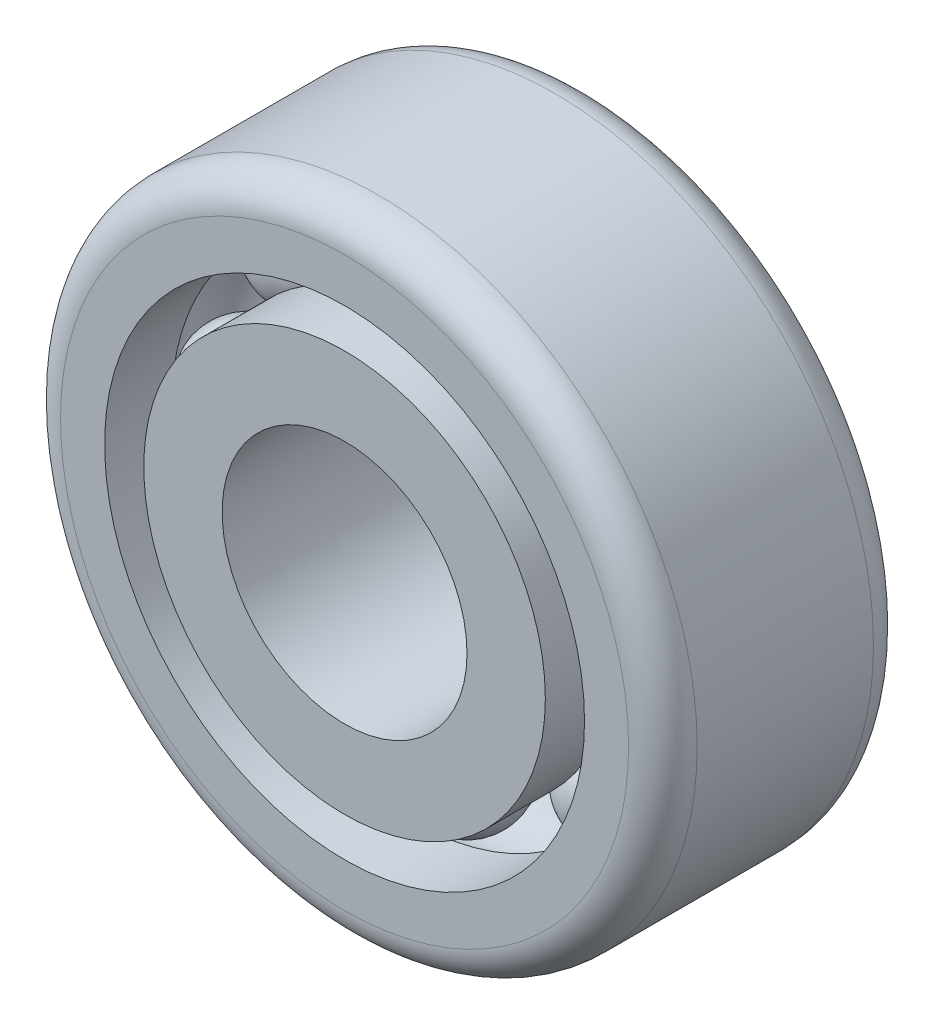
ISO-10303-21;
HEADER;
FILE_DESCRIPTION(('STEP AP214'),'2;1');
FILE_NAME('part.step','',(''),(''),'','','');
FILE_SCHEMA(('AUTOMOTIVE_DESIGN { 1 0 10303 214 1 1 1 1 }'));
ENDSEC;
DATA;
#1=APPLICATION_CONTEXT('core data for automotive mechanical design processes');
#2=APPLICATION_PROTOCOL_DEFINITION('international standard','automotive_design',2000,#1);
#3=PRODUCT_CONTEXT('',#1,'mechanical');
#4=PRODUCT('Part','Part','',(#3));
#5=PRODUCT_RELATED_PRODUCT_CATEGORY('part','',(#4));
#6=PRODUCT_DEFINITION_FORMATION('','',#4);
#7=PRODUCT_DEFINITION_CONTEXT('part definition',#1,'design');
#8=PRODUCT_DEFINITION('design','',#6,#7);
#9=PRODUCT_DEFINITION_SHAPE('','',#8);
#10=(LENGTH_UNIT() NAMED_UNIT(*) SI_UNIT(.MILLI.,.METRE.));
#11=(NAMED_UNIT(*) PLANE_ANGLE_UNIT() SI_UNIT($,.RADIAN.));
#12=(NAMED_UNIT(*) SI_UNIT($,.STERADIAN.) SOLID_ANGLE_UNIT());
#13=UNCERTAINTY_MEASURE_WITH_UNIT(LENGTH_MEASURE(1.E-05),#10,'distance_accuracy_value','');
#14=(GEOMETRIC_REPRESENTATION_CONTEXT(3) GLOBAL_UNCERTAINTY_ASSIGNED_CONTEXT((#13)) GLOBAL_UNIT_ASSIGNED_CONTEXT((#10,
#11,#12)) REPRESENTATION_CONTEXT('',''));
#15=CARTESIAN_POINT('',(0.,0.,0.));
#16=DIRECTION('',(0.,0.,1.));
#17=DIRECTION('',(1.,0.,0.));
#18=AXIS2_PLACEMENT_3D('',#15,#16,#17);
#19=CARTESIAN_POINT('',(-3.1819805153395,-3.18198051533943,0.00277476067090743));
#20=DIRECTION('',(0.,0.,-1.));
#21=DIRECTION('',(0.707106781186556,0.707106781186539,0.));
#22=AXIS2_PLACEMENT_3D('',#19,#20,#21);
#23=SPHERICAL_SURFACE('',#22,1.06393961341105);
#24=CARTESIAN_POINT('',(-3.1819805153395,-3.18198051533943,-1.06116485274014));
#25=VERTEX_POINT('',#24);
#26=VERTEX_LOOP('',#25);
#27=FACE_BOUND('',#26,.T.);
#28=ADVANCED_FACE('F39',(#27),#23,.T.);
#29=CLOSED_SHELL('',(#28));
#30=MANIFOLD_SOLID_BREP('B2',#29);
#31=CARTESIAN_POINT('',(0.,-4.5,0.00277476067090743));
#32=DIRECTION('',(0.,0.,-1.));
#33=DIRECTION('',(0.,1.,0.));
#34=AXIS2_PLACEMENT_3D('',#31,#32,#33);
#35=SPHERICAL_SURFACE('',#34,1.06393961341105);
#36=CARTESIAN_POINT('',(0.,-4.5,-1.06116485274014));
#37=VERTEX_POINT('',#36);
#38=VERTEX_LOOP('',#37);
#39=FACE_BOUND('',#38,.T.);
#40=ADVANCED_FACE('F57',(#39),#35,.T.);
#41=CLOSED_SHELL('',(#40));
#42=MANIFOLD_SOLID_BREP('B6',#41);
#43=CARTESIAN_POINT('',(3.18198051533944,-3.18198051533949,0.00277476067090743));
#44=DIRECTION('',(0.,0.,-1.));
#45=DIRECTION('',(-0.707106781186541,0.707106781186554,0.));
#46=AXIS2_PLACEMENT_3D('',#43,#44,#45);
#47=SPHERICAL_SURFACE('',#46,1.06393961341105);
#48=CARTESIAN_POINT('',(3.18198051533944,-3.18198051533949,-1.06116485274014));
#49=VERTEX_POINT('',#48);
#50=VERTEX_LOOP('',#49);
#51=FACE_BOUND('',#50,.T.);
#52=ADVANCED_FACE('F75',(#51),#47,.T.);
#53=CLOSED_SHELL('',(#52));
#54=MANIFOLD_SOLID_BREP('B35',#53);
#55=CARTESIAN_POINT('',(4.5,0.,0.00277476067090743));
#56=DIRECTION('',(0.,0.,-1.));
#57=DIRECTION('',(-1.,0.,0.));
#58=AXIS2_PLACEMENT_3D('',#55,#56,#57);
#59=SPHERICAL_SURFACE('',#58,1.06393961341105);
#60=CARTESIAN_POINT('',(4.5,0.,-1.06116485274014));
#61=VERTEX_POINT('',#60);
#62=VERTEX_LOOP('',#61);
#63=FACE_BOUND('',#62,.T.);
#64=ADVANCED_FACE('F93',(#63),#59,.T.);
#65=CLOSED_SHELL('',(#64));
#66=MANIFOLD_SOLID_BREP('B53',#65);
#67=CARTESIAN_POINT('',(3.18198051533948,3.18198051533945,0.00277476067090743));
#68=DIRECTION('',(0.,0.,-1.));
#69=DIRECTION('',(-0.707106781186551,-0.707106781186544,0.));
#70=AXIS2_PLACEMENT_3D('',#67,#68,#69);
#71=SPHERICAL_SURFACE('',#70,1.06393961341105);
#72=CARTESIAN_POINT('',(3.18198051533948,3.18198051533945,-1.06116485274014));
#73=VERTEX_POINT('',#72);
#74=VERTEX_LOOP('',#73);
#75=FACE_BOUND('',#74,.T.);
#76=ADVANCED_FACE('F111',(#75),#71,.T.);
#77=CLOSED_SHELL('',(#76));
#78=MANIFOLD_SOLID_BREP('B71',#77);
#79=CARTESIAN_POINT('',(0.,4.5,0.00277476067090743));
#80=DIRECTION('',(0.,0.,-1.));
#81=DIRECTION('',(0.,-1.,0.));
#82=AXIS2_PLACEMENT_3D('',#79,#80,#81);
#83=SPHERICAL_SURFACE('',#82,1.06393961341105);
#84=CARTESIAN_POINT('',(0.,4.5,-1.06116485274014));
#85=VERTEX_POINT('',#84);
#86=VERTEX_LOOP('',#85);
#87=FACE_BOUND('',#86,.T.);
#88=ADVANCED_FACE('F129',(#87),#83,.T.);
#89=CLOSED_SHELL('',(#88));
#90=MANIFOLD_SOLID_BREP('B89',#89);
#91=CARTESIAN_POINT('',(-3.18198051533946,3.18198051533947,0.00277476067090743));
#92=DIRECTION('',(0.,0.,-1.));
#93=DIRECTION('',(0.707106781186546,-0.707106781186549,0.));
#94=AXIS2_PLACEMENT_3D('',#91,#92,#93);
#95=SPHERICAL_SURFACE('',#94,1.06393961341105);
#96=CARTESIAN_POINT('',(-3.18198051533946,3.18198051533947,-1.06116485274014));
#97=VERTEX_POINT('',#96);
#98=VERTEX_LOOP('',#97);
#99=FACE_BOUND('',#98,.T.);
#100=ADVANCED_FACE('F147',(#99),#95,.T.);
#101=CLOSED_SHELL('',(#100));
#102=MANIFOLD_SOLID_BREP('B107',#101);
#103=CARTESIAN_POINT('',(-4.5,0.,0.00277476067090743));
#104=DIRECTION('',(0.,0.,-1.));
#105=DIRECTION('',(1.,0.,0.));
#106=AXIS2_PLACEMENT_3D('',#103,#104,#105);
#107=SPHERICAL_SURFACE('',#106,1.06393961341105);
#108=CARTESIAN_POINT('',(-4.5,0.,-1.06116485274014));
#109=VERTEX_POINT('',#108);
#110=VERTEX_LOOP('',#109);
#111=FACE_BOUND('',#110,.T.);
#112=ADVANCED_FACE('F167',(#111),#107,.T.);
#113=CLOSED_SHELL('',(#112));
#114=MANIFOLD_SOLID_BREP('B125',#113);
#115=CARTESIAN_POINT('',(0.,0.,0.));
#116=DIRECTION('',(0.,0.,1.));
#117=DIRECTION('',(1.,0.,0.));
#118=AXIS2_PLACEMENT_3D('',#115,#116,#117);
#119=CYLINDRICAL_SURFACE('',#118,2.5);
#120=CARTESIAN_POINT('',(0.,0.,-2.5));
#121=DIRECTION('',(0.,0.,1.));
#122=DIRECTION('',(1.,0.,0.));
#123=AXIS2_PLACEMENT_3D('',#120,#121,#122);
#124=CIRCLE('',#123,2.5);
#125=CARTESIAN_POINT('',(2.5,0.,-2.5));
#126=VERTEX_POINT('',#125);
#127=EDGE_CURVE('E166',#126,#126,#124,.T.);
#128=ORIENTED_EDGE('',*,*,#127,.F.);
#129=EDGE_LOOP('',(#128));
#130=FACE_BOUND('',#129,.T.);
#131=CARTESIAN_POINT('',(0.,0.,2.5));
#132=DIRECTION('',(0.,0.,1.));
#133=DIRECTION('',(1.,0.,0.));
#134=AXIS2_PLACEMENT_3D('',#131,#132,#133);
#135=CIRCLE('',#134,2.5);
#136=CARTESIAN_POINT('',(2.5,0.,2.5));
#137=VERTEX_POINT('',#136);
#138=EDGE_CURVE('E208',#137,#137,#135,.T.);
#139=ORIENTED_EDGE('',*,*,#138,.T.);
#140=EDGE_LOOP('',(#139));
#141=FACE_BOUND('',#140,.T.);
#142=ADVANCED_FACE('F186',(#130,#141),#119,.F.);
#143=CARTESIAN_POINT('',(-4.1,0.,-2.5));
#144=DIRECTION('',(0.,0.,1.));
#145=DIRECTION('',(1.,0.,0.));
#146=AXIS2_PLACEMENT_3D('',#143,#144,#145);
#147=PLANE('',#146);
#148=CARTESIAN_POINT('',(0.,0.,-2.5));
#149=DIRECTION('',(0.,0.,1.));
#150=DIRECTION('',(1.,0.,0.));
#151=AXIS2_PLACEMENT_3D('',#148,#149,#150);
#152=CIRCLE('',#151,4.1);
#153=CARTESIAN_POINT('',(4.1,0.,-2.5));
#154=VERTEX_POINT('',#153);
#155=EDGE_CURVE('E192',#154,#154,#152,.T.);
#156=ORIENTED_EDGE('',*,*,#155,.F.);
#157=EDGE_LOOP('',(#156));
#158=FACE_BOUND('',#157,.T.);
#159=ORIENTED_EDGE('',*,*,#127,.T.);
#160=EDGE_LOOP('',(#159));
#161=FACE_BOUND('',#160,.T.);
#162=ADVANCED_FACE('F233',(#158,#161),#147,.F.);
#163=CARTESIAN_POINT('',(0.,0.,0.));
#164=DIRECTION('',(0.,0.,1.));
#165=DIRECTION('',(1.,0.,0.));
#166=AXIS2_PLACEMENT_3D('',#163,#164,#165);
#167=CYLINDRICAL_SURFACE('',#166,4.1);
#168=CARTESIAN_POINT('',(0.,0.,-1.13137084989848));
#169=DIRECTION('',(0.,0.,1.));
#170=DIRECTION('',(1.,0.,0.));
#171=AXIS2_PLACEMENT_3D('',#168,#169,#170);
#172=CIRCLE('',#171,4.1);
#173=CARTESIAN_POINT('',(4.1,0.,-1.13137084989848));
#174=VERTEX_POINT('',#173);
#175=EDGE_CURVE('E196',#174,#174,#172,.T.);
#176=ORIENTED_EDGE('',*,*,#175,.F.);
#177=EDGE_LOOP('',(#176));
#178=FACE_BOUND('',#177,.T.);
#179=ORIENTED_EDGE('',*,*,#155,.T.);
#180=EDGE_LOOP('',(#179));
#181=FACE_BOUND('',#180,.T.);
#182=ADVANCED_FACE('F228',(#178,#181),#167,.T.);
#183=CARTESIAN_POINT('',(0.,0.,0.));
#184=DIRECTION('',(0.,0.,1.));
#185=DIRECTION('',(1.,0.,0.));
#186=AXIS2_PLACEMENT_3D('',#183,#184,#185);
#187=TOROIDAL_SURFACE('',#186,4.5,1.2);
#188=CARTESIAN_POINT('',(0.,0.,1.13137084989847));
#189=DIRECTION('',(0.,0.,1.));
#190=DIRECTION('',(1.,0.,0.));
#191=AXIS2_PLACEMENT_3D('',#188,#189,#190);
#192=CIRCLE('',#191,4.1);
#193=CARTESIAN_POINT('',(4.1,0.,1.13137084989847));
#194=VERTEX_POINT('',#193);
#195=EDGE_CURVE('E200',#194,#194,#192,.T.);
#196=ORIENTED_EDGE('',*,*,#195,.F.);
#197=EDGE_LOOP('',(#196));
#198=FACE_BOUND('',#197,.T.);
#199=ORIENTED_EDGE('',*,*,#175,.T.);
#200=EDGE_LOOP('',(#199));
#201=FACE_BOUND('',#200,.T.);
#202=ADVANCED_FACE('F222',(#198,#201),#187,.F.);
#203=CARTESIAN_POINT('',(0.,0.,0.));
#204=DIRECTION('',(0.,0.,1.));
#205=DIRECTION('',(1.,0.,0.));
#206=AXIS2_PLACEMENT_3D('',#203,#204,#205);
#207=CYLINDRICAL_SURFACE('',#206,4.1);
#208=CARTESIAN_POINT('',(0.,0.,2.5));
#209=DIRECTION('',(0.,0.,1.));
#210=DIRECTION('',(1.,0.,0.));
#211=AXIS2_PLACEMENT_3D('',#208,#209,#210);
#212=CIRCLE('',#211,4.1);
#213=CARTESIAN_POINT('',(4.1,0.,2.5));
#214=VERTEX_POINT('',#213);
#215=EDGE_CURVE('E205',#214,#214,#212,.T.);
#216=ORIENTED_EDGE('',*,*,#215,.F.);
#217=EDGE_LOOP('',(#216));
#218=FACE_BOUND('',#217,.T.);
#219=ORIENTED_EDGE('',*,*,#195,.T.);
#220=EDGE_LOOP('',(#219));
#221=FACE_BOUND('',#220,.T.);
#222=ADVANCED_FACE('F216',(#218,#221),#207,.T.);
#223=CARTESIAN_POINT('',(-4.1,0.,2.5));
#224=DIRECTION('',(0.,0.,-1.));
#225=DIRECTION('',(-1.,0.,0.));
#226=AXIS2_PLACEMENT_3D('',#223,#224,#225);
#227=PLANE('',#226);
#228=ORIENTED_EDGE('',*,*,#138,.F.);
#229=EDGE_LOOP('',(#228));
#230=FACE_BOUND('',#229,.T.);
#231=ORIENTED_EDGE('',*,*,#215,.T.);
#232=EDGE_LOOP('',(#231));
#233=FACE_BOUND('',#232,.T.);
#234=ADVANCED_FACE('F213',(#230,#233),#227,.F.);
#235=CLOSED_SHELL('',(#142,#162,#182,#202,#222,#234));
#236=MANIFOLD_SOLID_BREP('B143',#235);
#237=CARTESIAN_POINT('',(0.,0.,0.));
#238=DIRECTION('',(0.,0.,1.));
#239=DIRECTION('',(1.,0.,0.));
#240=AXIS2_PLACEMENT_3D('',#237,#238,#239);
#241=CYLINDRICAL_SURFACE('',#240,6.5);
#242=CARTESIAN_POINT('',(0.,0.,1.8));
#243=DIRECTION('',(0.,0.,-1.));
#244=DIRECTION('',(-1.,0.,0.));
#245=AXIS2_PLACEMENT_3D('',#242,#243,#244);
#246=CIRCLE('',#245,6.5);
#247=CARTESIAN_POINT('',(-6.5,0.,1.8));
#248=VERTEX_POINT('',#247);
#249=EDGE_CURVE('E284',#248,#248,#246,.T.);
#250=ORIENTED_EDGE('',*,*,#249,.T.);
#251=EDGE_LOOP('',(#250));
#252=FACE_BOUND('',#251,.T.);
#253=CARTESIAN_POINT('',(0.,0.,-1.8));
#254=DIRECTION('',(0.,0.,1.));
#255=DIRECTION('',(1.,0.,0.));
#256=AXIS2_PLACEMENT_3D('',#253,#254,#255);
#257=CIRCLE('',#256,6.5);
#258=CARTESIAN_POINT('',(6.5,0.,-1.8));
#259=VERTEX_POINT('',#258);
#260=EDGE_CURVE('E288',#259,#259,#257,.T.);
#261=ORIENTED_EDGE('',*,*,#260,.T.);
#262=EDGE_LOOP('',(#261));
#263=FACE_BOUND('',#262,.T.);
#264=ADVANCED_FACE('F277',(#252,#263),#241,.T.);
#265=CARTESIAN_POINT('',(-4.9,0.,2.5));
#266=DIRECTION('',(0.,0.,-1.));
#267=DIRECTION('',(-1.,0.,0.));
#268=AXIS2_PLACEMENT_3D('',#265,#266,#267);
#269=PLANE('',#268);
#270=CARTESIAN_POINT('',(0.,0.,2.5));
#271=DIRECTION('',(0.,0.,-1.));
#272=DIRECTION('',(-1.,0.,0.));
#273=AXIS2_PLACEMENT_3D('',#270,#271,#272);
#274=CIRCLE('',#273,5.8);
#275=CARTESIAN_POINT('',(-5.8,0.,2.5));
#276=VERTEX_POINT('',#275);
#277=EDGE_CURVE('E292',#276,#276,#274,.F.);
#278=ORIENTED_EDGE('',*,*,#277,.T.);
#279=EDGE_LOOP('',(#278));
#280=FACE_BOUND('',#279,.T.);
#281=CARTESIAN_POINT('',(0.,0.,2.5));
#282=DIRECTION('',(0.,0.,1.));
#283=DIRECTION('',(1.,0.,0.));
#284=AXIS2_PLACEMENT_3D('',#281,#282,#283);
#285=CIRCLE('',#284,4.9);
#286=CARTESIAN_POINT('',(4.9,0.,2.5));
#287=VERTEX_POINT('',#286);
#288=EDGE_CURVE('E297',#287,#287,#285,.T.);
#289=ORIENTED_EDGE('',*,*,#288,.F.);
#290=EDGE_LOOP('',(#289));
#291=FACE_BOUND('',#290,.T.);
#292=ADVANCED_FACE('F327',(#280,#291),#269,.F.);
#293=CARTESIAN_POINT('',(0.,0.,0.));
#294=DIRECTION('',(0.,0.,1.));
#295=DIRECTION('',(1.,0.,0.));
#296=AXIS2_PLACEMENT_3D('',#293,#294,#295);
#297=CYLINDRICAL_SURFACE('',#296,4.9);
#298=CARTESIAN_POINT('',(0.,0.,1.13137084989847));
#299=DIRECTION('',(0.,0.,1.));
#300=DIRECTION('',(1.,0.,0.));
#301=AXIS2_PLACEMENT_3D('',#298,#299,#300);
#302=CIRCLE('',#301,4.9);
#303=CARTESIAN_POINT('',(4.9,0.,1.13137084989847));
#304=VERTEX_POINT('',#303);
#305=EDGE_CURVE('E300',#304,#304,#302,.T.);
#306=ORIENTED_EDGE('',*,*,#305,.F.);
#307=EDGE_LOOP('',(#306));
#308=FACE_BOUND('',#307,.T.);
#309=ORIENTED_EDGE('',*,*,#288,.T.);
#310=EDGE_LOOP('',(#309));
#311=FACE_BOUND('',#310,.T.);
#312=ADVANCED_FACE('F321',(#308,#311),#297,.F.);
#313=CARTESIAN_POINT('',(0.,0.,0.));
#314=DIRECTION('',(0.,0.,1.));
#315=DIRECTION('',(1.,0.,0.));
#316=AXIS2_PLACEMENT_3D('',#313,#314,#315);
#317=TOROIDAL_SURFACE('',#316,4.5,1.2);
#318=CARTESIAN_POINT('',(0.,0.,-1.13137084989848));
#319=DIRECTION('',(0.,0.,1.));
#320=DIRECTION('',(1.,0.,0.));
#321=AXIS2_PLACEMENT_3D('',#318,#319,#320);
#322=CIRCLE('',#321,4.9);
#323=CARTESIAN_POINT('',(4.9,0.,-1.13137084989848));
#324=VERTEX_POINT('',#323);
#325=EDGE_CURVE('E303',#324,#324,#322,.T.);
#326=ORIENTED_EDGE('',*,*,#325,.F.);
#327=EDGE_LOOP('',(#326));
#328=FACE_BOUND('',#327,.T.);
#329=ORIENTED_EDGE('',*,*,#305,.T.);
#330=EDGE_LOOP('',(#329));
#331=FACE_BOUND('',#330,.T.);
#332=ADVANCED_FACE('F315',(#328,#331),#317,.F.);
#333=CARTESIAN_POINT('',(0.,0.,0.));
#334=DIRECTION('',(0.,0.,1.));
#335=DIRECTION('',(1.,0.,0.));
#336=AXIS2_PLACEMENT_3D('',#333,#334,#335);
#337=CYLINDRICAL_SURFACE('',#336,4.9);
#338=CARTESIAN_POINT('',(0.,0.,-2.5));
#339=DIRECTION('',(0.,0.,1.));
#340=DIRECTION('',(1.,0.,0.));
#341=AXIS2_PLACEMENT_3D('',#338,#339,#340);
#342=CIRCLE('',#341,4.9);
#343=CARTESIAN_POINT('',(4.9,0.,-2.5));
#344=VERTEX_POINT('',#343);
#345=EDGE_CURVE('E306',#344,#344,#342,.T.);
#346=ORIENTED_EDGE('',*,*,#345,.F.);
#347=EDGE_LOOP('',(#346));
#348=FACE_BOUND('',#347,.T.);
#349=ORIENTED_EDGE('',*,*,#325,.T.);
#350=EDGE_LOOP('',(#349));
#351=FACE_BOUND('',#350,.T.);
#352=ADVANCED_FACE('F312',(#348,#351),#337,.F.);
#353=CARTESIAN_POINT('',(-4.9,0.,-2.5));
#354=DIRECTION('',(0.,0.,1.));
#355=DIRECTION('',(1.,0.,0.));
#356=AXIS2_PLACEMENT_3D('',#353,#354,#355);
#357=PLANE('',#356);
#358=CARTESIAN_POINT('',(0.,0.,-2.5));
#359=DIRECTION('',(0.,0.,1.));
#360=DIRECTION('',(1.,0.,0.));
#361=AXIS2_PLACEMENT_3D('',#358,#359,#360);
#362=CIRCLE('',#361,5.8);
#363=CARTESIAN_POINT('',(5.8,0.,-2.5));
#364=VERTEX_POINT('',#363);
#365=EDGE_CURVE('E185',#364,#364,#362,.F.);
#366=ORIENTED_EDGE('',*,*,#365,.T.);
#367=EDGE_LOOP('',(#366));
#368=FACE_BOUND('',#367,.T.);
#369=ORIENTED_EDGE('',*,*,#345,.T.);
#370=EDGE_LOOP('',(#369));
#371=FACE_BOUND('',#370,.T.);
#372=ADVANCED_FACE('F310',(#368,#371),#357,.F.);
#373=CARTESIAN_POINT('',(0.,0.,1.8));
#374=DIRECTION('',(0.,0.,-1.));
#375=DIRECTION('',(-1.,0.,0.));
#376=AXIS2_PLACEMENT_3D('',#373,#374,#375);
#377=TOROIDAL_SURFACE('',#376,5.8,0.7);
#378=ORIENTED_EDGE('',*,*,#249,.F.);
#379=EDGE_LOOP('',(#378));
#380=FACE_BOUND('',#379,.T.);
#381=ORIENTED_EDGE('',*,*,#277,.F.);
#382=EDGE_LOOP('',(#381));
#383=FACE_BOUND('',#382,.T.);
#384=ADVANCED_FACE('F338',(#380,#383),#377,.T.);
#385=CARTESIAN_POINT('',(0.,0.,-1.8));
#386=DIRECTION('',(0.,0.,1.));
#387=DIRECTION('',(1.,0.,0.));
#388=AXIS2_PLACEMENT_3D('',#385,#386,#387);
#389=TOROIDAL_SURFACE('',#388,5.8,0.7);
#390=ORIENTED_EDGE('',*,*,#365,.F.);
#391=EDGE_LOOP('',(#390));
#392=FACE_BOUND('',#391,.T.);
#393=ORIENTED_EDGE('',*,*,#260,.F.);
#394=EDGE_LOOP('',(#393));
#395=FACE_BOUND('',#394,.T.);
#396=ADVANCED_FACE('F279',(#392,#395),#389,.T.);
#397=CLOSED_SHELL('',(#264,#292,#312,#332,#352,#372,#384,#396));
#398=MANIFOLD_SOLID_BREP('B161',#397);
#399=ADVANCED_BREP_SHAPE_REPRESENTATION('',(#18,#30,#42,#54,#66,#78,#90,#102,#114,#236,#398),#14);
#400=SHAPE_DEFINITION_REPRESENTATION(#9,#399);
ENDSEC;
END-ISO-10303-21;
